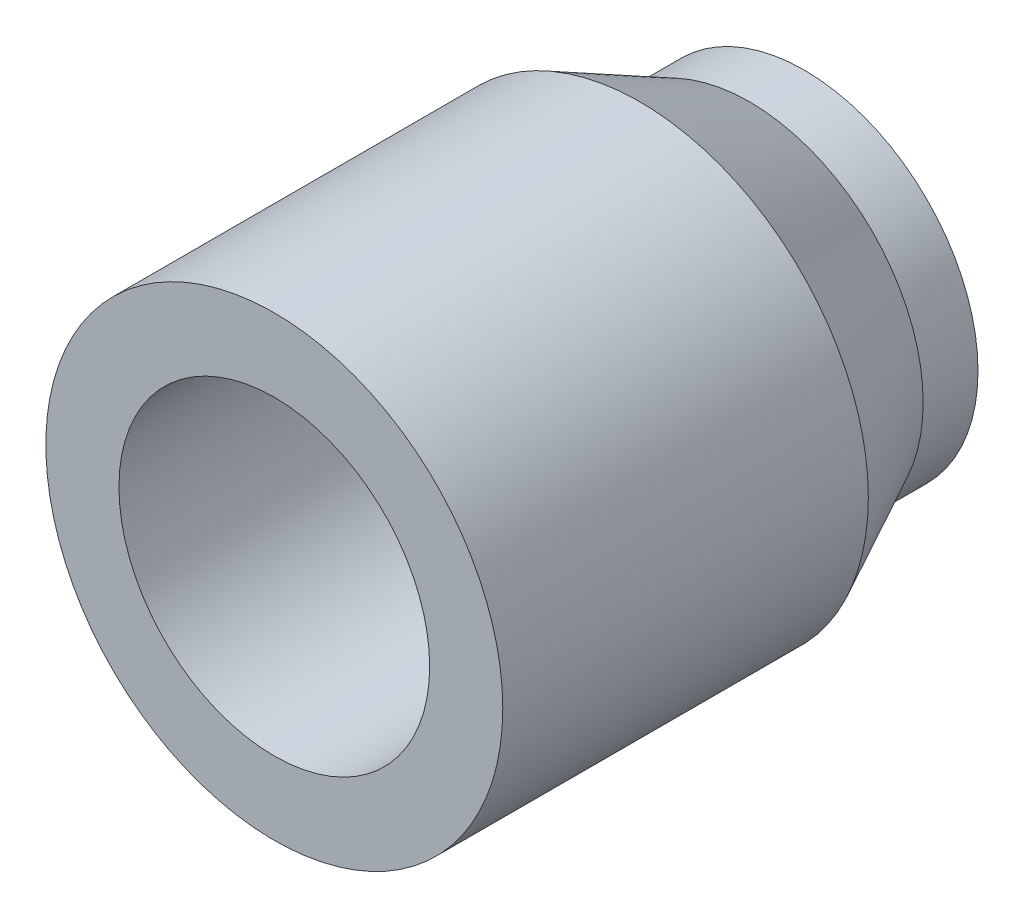
ISO-10303-21;
HEADER;
FILE_DESCRIPTION(('STEP AP214'),'2;1');
FILE_NAME('part.step','',(''),(''),'','','');
FILE_SCHEMA(('AUTOMOTIVE_DESIGN { 1 0 10303 214 1 1 1 1 }'));
ENDSEC;
DATA;
#1=APPLICATION_CONTEXT('core data for automotive mechanical design processes');
#2=APPLICATION_PROTOCOL_DEFINITION('international standard','automotive_design',2000,#1);
#3=PRODUCT_CONTEXT('',#1,'mechanical');
#4=PRODUCT('Part','Part','',(#3));
#5=PRODUCT_RELATED_PRODUCT_CATEGORY('part','',(#4));
#6=PRODUCT_DEFINITION_FORMATION('','',#4);
#7=PRODUCT_DEFINITION_CONTEXT('part definition',#1,'design');
#8=PRODUCT_DEFINITION('design','',#6,#7);
#9=PRODUCT_DEFINITION_SHAPE('','',#8);
#10=(LENGTH_UNIT() NAMED_UNIT(*) SI_UNIT(.MILLI.,.METRE.));
#11=(NAMED_UNIT(*) PLANE_ANGLE_UNIT() SI_UNIT($,.RADIAN.));
#12=(NAMED_UNIT(*) SI_UNIT($,.STERADIAN.) SOLID_ANGLE_UNIT());
#13=UNCERTAINTY_MEASURE_WITH_UNIT(LENGTH_MEASURE(1.E-05),#10,'distance_accuracy_value','');
#14=(GEOMETRIC_REPRESENTATION_CONTEXT(3) GLOBAL_UNCERTAINTY_ASSIGNED_CONTEXT((#13)) GLOBAL_UNIT_ASSIGNED_CONTEXT((#10,
#11,#12)) REPRESENTATION_CONTEXT('',''));
#15=CARTESIAN_POINT('',(0.,0.,0.));
#16=DIRECTION('',(0.,0.,1.));
#17=DIRECTION('',(1.,0.,0.));
#18=AXIS2_PLACEMENT_3D('',#15,#16,#17);
#19=CARTESIAN_POINT('',(0.,0.,0.));
#20=DIRECTION('',(0.,0.,1.));
#21=DIRECTION('',(1.,0.,0.));
#22=AXIS2_PLACEMENT_3D('',#19,#20,#21);
#23=CONICAL_SURFACE('',#22,4.75,0.463647609000806);
#24=CARTESIAN_POINT('',(0.,0.,0.));
#25=DIRECTION('',(0.,0.,1.));
#26=DIRECTION('',(1.,0.,0.));
#27=AXIS2_PLACEMENT_3D('',#24,#25,#26);
#28=CIRCLE('',#27,4.75);
#29=CARTESIAN_POINT('',(4.75,0.,0.));
#30=VERTEX_POINT('',#29);
#31=EDGE_CURVE('E71',#30,#30,#28,.T.);
#32=ORIENTED_EDGE('',*,*,#31,.T.);
#33=EDGE_LOOP('',(#32));
#34=FACE_BOUND('',#33,.T.);
#35=CARTESIAN_POINT('',(0.,0.,3.));
#36=DIRECTION('',(0.,0.,1.));
#37=DIRECTION('',(1.,0.,0.));
#38=AXIS2_PLACEMENT_3D('',#35,#36,#37);
#39=CIRCLE('',#38,6.25);
#40=CARTESIAN_POINT('',(6.25,0.,3.));
#41=VERTEX_POINT('',#40);
#42=EDGE_CURVE('E11',#41,#41,#39,.T.);
#43=ORIENTED_EDGE('',*,*,#42,.F.);
#44=EDGE_LOOP('',(#43));
#45=FACE_BOUND('',#44,.T.);
#46=ADVANCED_FACE('F37',(#34,#45),#23,.T.);
#47=CARTESIAN_POINT('',(0.,0.,0.));
#48=DIRECTION('',(0.,0.,1.));
#49=DIRECTION('',(1.,0.,0.));
#50=AXIS2_PLACEMENT_3D('',#47,#48,#49);
#51=CONICAL_SURFACE('',#50,2.75,0.463647609000806);
#52=CARTESIAN_POINT('',(0.,0.,0.));
#53=DIRECTION('',(0.,0.,1.));
#54=DIRECTION('',(1.,0.,0.));
#55=AXIS2_PLACEMENT_3D('',#52,#53,#54);
#56=CIRCLE('',#55,2.75);
#57=CARTESIAN_POINT('',(2.75,0.,0.));
#58=VERTEX_POINT('',#57);
#59=EDGE_CURVE('E45',#58,#58,#56,.T.);
#60=ORIENTED_EDGE('',*,*,#59,.F.);
#61=EDGE_LOOP('',(#60));
#62=FACE_BOUND('',#61,.T.);
#63=CARTESIAN_POINT('',(0.,0.,3.));
#64=DIRECTION('',(0.,0.,1.));
#65=DIRECTION('',(1.,0.,0.));
#66=AXIS2_PLACEMENT_3D('',#63,#64,#65);
#67=CIRCLE('',#66,4.25);
#68=CARTESIAN_POINT('',(4.25,0.,3.));
#69=VERTEX_POINT('',#68);
#70=EDGE_CURVE('E140',#69,#69,#67,.T.);
#71=ORIENTED_EDGE('',*,*,#70,.T.);
#72=EDGE_LOOP('',(#71));
#73=FACE_BOUND('',#72,.T.);
#74=ADVANCED_FACE('F87',(#62,#73),#51,.F.);
#75=CARTESIAN_POINT('',(0.,0.,-1.5));
#76=DIRECTION('',(0.,0.,1.));
#77=DIRECTION('',(1.,0.,0.));
#78=AXIS2_PLACEMENT_3D('',#75,#76,#77);
#79=CYLINDRICAL_SURFACE('',#78,4.75);
#80=CARTESIAN_POINT('',(0.,0.,-1.5));
#81=DIRECTION('',(0.,0.,1.));
#82=DIRECTION('',(1.,0.,0.));
#83=AXIS2_PLACEMENT_3D('',#80,#81,#82);
#84=CIRCLE('',#83,4.75);
#85=CARTESIAN_POINT('',(4.75,0.,-1.5));
#86=VERTEX_POINT('',#85);
#87=EDGE_CURVE('E51',#86,#86,#84,.T.);
#88=ORIENTED_EDGE('',*,*,#87,.T.);
#89=EDGE_LOOP('',(#88));
#90=FACE_BOUND('',#89,.T.);
#91=ORIENTED_EDGE('',*,*,#31,.F.);
#92=EDGE_LOOP('',(#91));
#93=FACE_BOUND('',#92,.T.);
#94=ADVANCED_FACE('F77',(#90,#93),#79,.T.);
#95=CARTESIAN_POINT('',(0.,0.,-1.5));
#96=DIRECTION('',(0.,0.,1.));
#97=DIRECTION('',(1.,0.,0.));
#98=AXIS2_PLACEMENT_3D('',#95,#96,#97);
#99=PLANE('',#98);
#100=CARTESIAN_POINT('',(0.,0.,-1.5));
#101=DIRECTION('',(0.,0.,1.));
#102=DIRECTION('',(1.,0.,0.));
#103=AXIS2_PLACEMENT_3D('',#100,#101,#102);
#104=CIRCLE('',#103,2.75);
#105=CARTESIAN_POINT('',(2.75,0.,-1.5));
#106=VERTEX_POINT('',#105);
#107=EDGE_CURVE('E153',#106,#106,#104,.T.);
#108=ORIENTED_EDGE('',*,*,#107,.T.);
#109=EDGE_LOOP('',(#108));
#110=FACE_BOUND('',#109,.T.);
#111=ORIENTED_EDGE('',*,*,#87,.F.);
#112=EDGE_LOOP('',(#111));
#113=FACE_BOUND('',#112,.T.);
#114=ADVANCED_FACE('F86',(#110,#113),#99,.F.);
#115=CARTESIAN_POINT('',(0.,0.,-1.5));
#116=DIRECTION('',(0.,0.,1.));
#117=DIRECTION('',(1.,0.,0.));
#118=AXIS2_PLACEMENT_3D('',#115,#116,#117);
#119=CYLINDRICAL_SURFACE('',#118,2.75);
#120=ORIENTED_EDGE('',*,*,#107,.F.);
#121=EDGE_LOOP('',(#120));
#122=FACE_BOUND('',#121,.T.);
#123=ORIENTED_EDGE('',*,*,#59,.T.);
#124=EDGE_LOOP('',(#123));
#125=FACE_BOUND('',#124,.T.);
#126=ADVANCED_FACE('F116',(#122,#125),#119,.F.);
#127=CARTESIAN_POINT('',(0.,0.,13.));
#128=DIRECTION('',(0.,0.,1.));
#129=DIRECTION('',(1.,0.,0.));
#130=AXIS2_PLACEMENT_3D('',#127,#128,#129);
#131=PLANE('',#130);
#132=CARTESIAN_POINT('',(0.,0.,13.));
#133=DIRECTION('',(0.,0.,1.));
#134=DIRECTION('',(1.,0.,0.));
#135=AXIS2_PLACEMENT_3D('',#132,#133,#134);
#136=CIRCLE('',#135,6.25);
#137=CARTESIAN_POINT('',(6.25,0.,13.));
#138=VERTEX_POINT('',#137);
#139=EDGE_CURVE('E149',#138,#138,#136,.T.);
#140=ORIENTED_EDGE('',*,*,#139,.T.);
#141=EDGE_LOOP('',(#140));
#142=FACE_BOUND('',#141,.T.);
#143=CARTESIAN_POINT('',(0.,0.,13.));
#144=DIRECTION('',(0.,0.,1.));
#145=DIRECTION('',(1.,0.,0.));
#146=AXIS2_PLACEMENT_3D('',#143,#144,#145);
#147=CIRCLE('',#146,4.25);
#148=CARTESIAN_POINT('',(4.25,0.,13.));
#149=VERTEX_POINT('',#148);
#150=EDGE_CURVE('E146',#149,#149,#147,.T.);
#151=ORIENTED_EDGE('',*,*,#150,.F.);
#152=EDGE_LOOP('',(#151));
#153=FACE_BOUND('',#152,.T.);
#154=ADVANCED_FACE('F124',(#142,#153),#131,.T.);
#155=CARTESIAN_POINT('',(0.,0.,13.));
#156=DIRECTION('',(0.,0.,-1.));
#157=DIRECTION('',(-1.,0.,0.));
#158=AXIS2_PLACEMENT_3D('',#155,#156,#157);
#159=CYLINDRICAL_SURFACE('',#158,6.25);
#160=ORIENTED_EDGE('',*,*,#139,.F.);
#161=EDGE_LOOP('',(#160));
#162=FACE_BOUND('',#161,.T.);
#163=ORIENTED_EDGE('',*,*,#42,.T.);
#164=EDGE_LOOP('',(#163));
#165=FACE_BOUND('',#164,.T.);
#166=ADVANCED_FACE('F126',(#162,#165),#159,.T.);
#167=CARTESIAN_POINT('',(0.,0.,13.));
#168=DIRECTION('',(0.,0.,-1.));
#169=DIRECTION('',(-1.,0.,0.));
#170=AXIS2_PLACEMENT_3D('',#167,#168,#169);
#171=CYLINDRICAL_SURFACE('',#170,4.25);
#172=ORIENTED_EDGE('',*,*,#150,.T.);
#173=EDGE_LOOP('',(#172));
#174=FACE_BOUND('',#173,.T.);
#175=ORIENTED_EDGE('',*,*,#70,.F.);
#176=EDGE_LOOP('',(#175));
#177=FACE_BOUND('',#176,.T.);
#178=ADVANCED_FACE('F130',(#174,#177),#171,.F.);
#179=CLOSED_SHELL('',(#46,#74,#94,#114,#126,#154,#166,#178));
#180=MANIFOLD_SOLID_BREP('B2',#179);
#181=ADVANCED_BREP_SHAPE_REPRESENTATION('',(#18,#180),#14);
#182=SHAPE_DEFINITION_REPRESENTATION(#9,#181);
ENDSEC;
END-ISO-10303-21;
